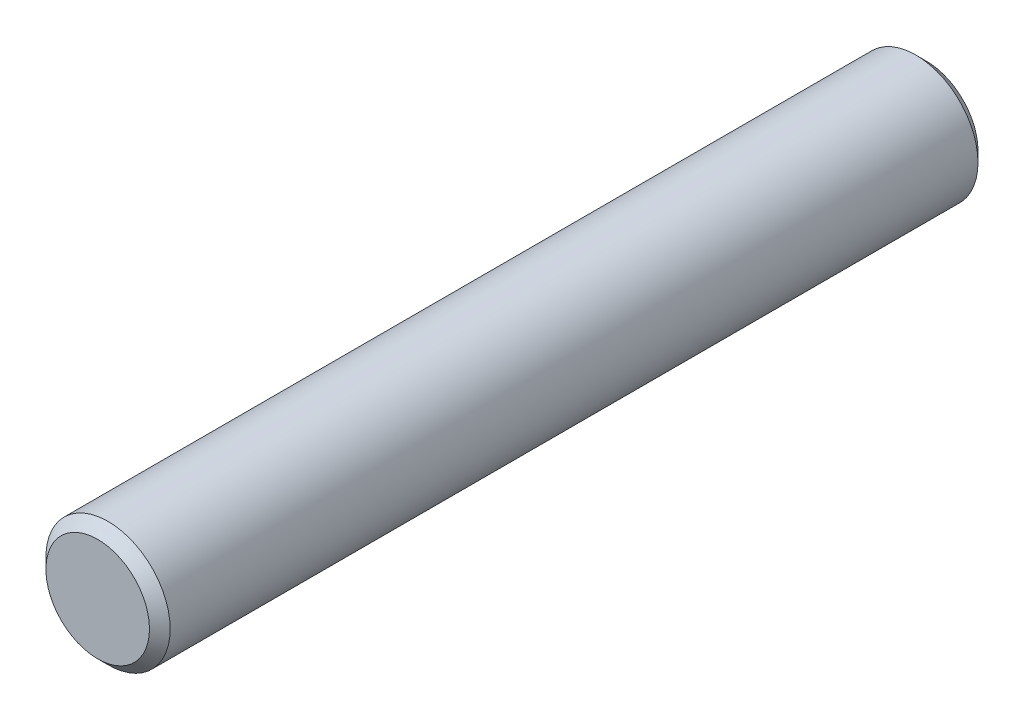
ISO-10303-21;
HEADER;
FILE_DESCRIPTION(('STEP AP214'),'2;1');
FILE_NAME('part.step','',(''),(''),'','','');
FILE_SCHEMA(('AUTOMOTIVE_DESIGN { 1 0 10303 214 1 1 1 1 }'));
ENDSEC;
DATA;
#1=APPLICATION_CONTEXT('core data for automotive mechanical design processes');
#2=APPLICATION_PROTOCOL_DEFINITION('international standard','automotive_design',2000,#1);
#3=PRODUCT_CONTEXT('',#1,'mechanical');
#4=PRODUCT('Part','Part','',(#3));
#5=PRODUCT_RELATED_PRODUCT_CATEGORY('part','',(#4));
#6=PRODUCT_DEFINITION_FORMATION('','',#4);
#7=PRODUCT_DEFINITION_CONTEXT('part definition',#1,'design');
#8=PRODUCT_DEFINITION('design','',#6,#7);
#9=PRODUCT_DEFINITION_SHAPE('','',#8);
#10=(LENGTH_UNIT() NAMED_UNIT(*) SI_UNIT(.MILLI.,.METRE.));
#11=(NAMED_UNIT(*) PLANE_ANGLE_UNIT() SI_UNIT($,.RADIAN.));
#12=(NAMED_UNIT(*) SI_UNIT($,.STERADIAN.) SOLID_ANGLE_UNIT());
#13=UNCERTAINTY_MEASURE_WITH_UNIT(LENGTH_MEASURE(1.E-05),#10,'distance_accuracy_value','');
#14=(GEOMETRIC_REPRESENTATION_CONTEXT(3) GLOBAL_UNCERTAINTY_ASSIGNED_CONTEXT((#13)) GLOBAL_UNIT_ASSIGNED_CONTEXT((#10,
#11,#12)) REPRESENTATION_CONTEXT('',''));
#15=CARTESIAN_POINT('',(0.,0.,0.));
#16=DIRECTION('',(0.,0.,1.));
#17=DIRECTION('',(1.,0.,0.));
#18=AXIS2_PLACEMENT_3D('',#15,#16,#17);
#19=CARTESIAN_POINT('',(0.,0.,40.));
#20=DIRECTION('',(0.,0.,-1.));
#21=DIRECTION('',(-1.,0.,0.));
#22=AXIS2_PLACEMENT_3D('',#19,#20,#21);
#23=CYLINDRICAL_SURFACE('',#22,3.);
#24=CARTESIAN_POINT('',(0.,0.,39.5));
#25=DIRECTION('',(0.,0.,1.));
#26=DIRECTION('',(1.,0.,0.));
#27=AXIS2_PLACEMENT_3D('',#24,#25,#26);
#28=CIRCLE('',#27,3.);
#29=CARTESIAN_POINT('',(3.,0.,39.5));
#30=VERTEX_POINT('',#29);
#31=EDGE_CURVE('E36',#30,#30,#28,.F.);
#32=ORIENTED_EDGE('',*,*,#31,.T.);
#33=EDGE_LOOP('',(#32));
#34=FACE_BOUND('',#33,.T.);
#35=CARTESIAN_POINT('',(0.,0.,0.499999999999994));
#36=DIRECTION('',(0.,0.,1.));
#37=DIRECTION('',(1.,0.,0.));
#38=AXIS2_PLACEMENT_3D('',#35,#36,#37);
#39=CIRCLE('',#38,3.);
#40=CARTESIAN_POINT('',(3.,0.,0.499999999999994));
#41=VERTEX_POINT('',#40);
#42=EDGE_CURVE('E40',#41,#41,#39,.T.);
#43=ORIENTED_EDGE('',*,*,#42,.T.);
#44=EDGE_LOOP('',(#43));
#45=FACE_BOUND('',#44,.T.);
#46=ADVANCED_FACE('F29',(#34,#45),#23,.T.);
#47=CARTESIAN_POINT('',(0.,0.,40.));
#48=DIRECTION('',(0.,0.,1.));
#49=DIRECTION('',(1.,0.,0.));
#50=AXIS2_PLACEMENT_3D('',#47,#48,#49);
#51=PLANE('',#50);
#52=CARTESIAN_POINT('',(0.,0.,40.));
#53=DIRECTION('',(0.,0.,1.));
#54=DIRECTION('',(1.,0.,0.));
#55=AXIS2_PLACEMENT_3D('',#52,#53,#54);
#56=CIRCLE('',#55,2.50000000000001);
#57=CARTESIAN_POINT('',(2.50000000000001,0.,40.));
#58=VERTEX_POINT('',#57);
#59=EDGE_CURVE('E44',#58,#58,#56,.T.);
#60=ORIENTED_EDGE('',*,*,#59,.T.);
#61=EDGE_LOOP('',(#60));
#62=FACE_BOUND('',#61,.T.);
#63=ADVANCED_FACE('F50',(#62),#51,.T.);
#64=CARTESIAN_POINT('',(0.,0.,0.));
#65=DIRECTION('',(0.,0.,1.));
#66=DIRECTION('',(1.,0.,0.));
#67=AXIS2_PLACEMENT_3D('',#64,#65,#66);
#68=PLANE('',#67);
#69=CARTESIAN_POINT('',(0.,0.,0.));
#70=DIRECTION('',(0.,0.,1.));
#71=DIRECTION('',(1.,0.,0.));
#72=AXIS2_PLACEMENT_3D('',#69,#70,#71);
#73=CIRCLE('',#72,2.50000000000001);
#74=CARTESIAN_POINT('',(2.50000000000001,0.,0.));
#75=VERTEX_POINT('',#74);
#76=EDGE_CURVE('E10',#75,#75,#73,.F.);
#77=ORIENTED_EDGE('',*,*,#76,.T.);
#78=EDGE_LOOP('',(#77));
#79=FACE_BOUND('',#78,.T.);
#80=ADVANCED_FACE('F54',(#79),#68,.F.);
#81=CARTESIAN_POINT('',(0.,0.,40.));
#82=DIRECTION('',(0.,0.,-1.));
#83=DIRECTION('',(-1.,0.,0.));
#84=AXIS2_PLACEMENT_3D('',#81,#82,#83);
#85=CONICAL_SURFACE('',#84,2.50000000000001,0.785398163397443);
#86=ORIENTED_EDGE('',*,*,#31,.F.);
#87=EDGE_LOOP('',(#86));
#88=FACE_BOUND('',#87,.T.);
#89=ORIENTED_EDGE('',*,*,#59,.F.);
#90=EDGE_LOOP('',(#89));
#91=FACE_BOUND('',#90,.T.);
#92=ADVANCED_FACE('F52',(#88,#91),#85,.T.);
#93=CARTESIAN_POINT('',(0.,0.,0.499999999999994));
#94=DIRECTION('',(0.,0.,1.));
#95=DIRECTION('',(1.,0.,0.));
#96=AXIS2_PLACEMENT_3D('',#93,#94,#95);
#97=CONICAL_SURFACE('',#96,3.,0.785398163397449);
#98=ORIENTED_EDGE('',*,*,#76,.F.);
#99=EDGE_LOOP('',(#98));
#100=FACE_BOUND('',#99,.T.);
#101=ORIENTED_EDGE('',*,*,#42,.F.);
#102=EDGE_LOOP('',(#101));
#103=FACE_BOUND('',#102,.T.);
#104=ADVANCED_FACE('F31',(#100,#103),#97,.T.);
#105=CLOSED_SHELL('',(#46,#63,#80,#92,#104));
#106=MANIFOLD_SOLID_BREP('B2',#105);
#107=ADVANCED_BREP_SHAPE_REPRESENTATION('',(#18,#106),#14);
#108=SHAPE_DEFINITION_REPRESENTATION(#9,#107);
ENDSEC;
END-ISO-10303-21;
